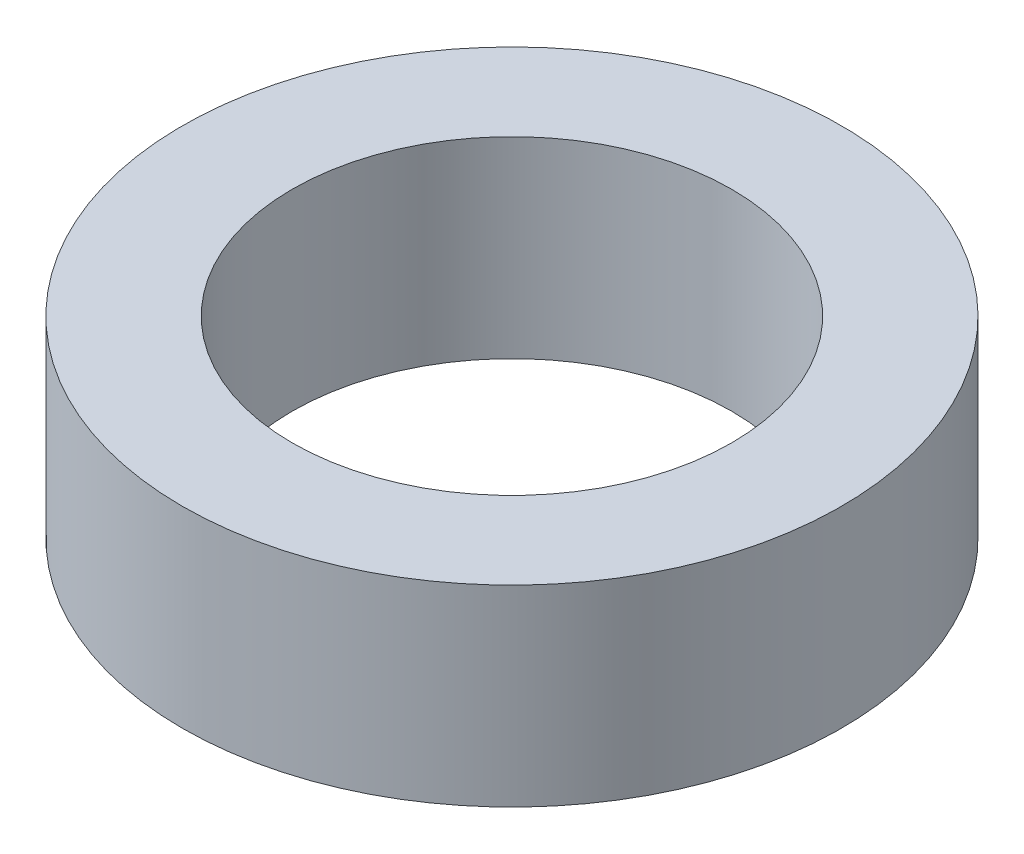
ISO-10303-21;
HEADER;
FILE_DESCRIPTION(('STEP AP214'),'2;1');
FILE_NAME('part.step','',(''),(''),'','','');
FILE_SCHEMA(('AUTOMOTIVE_DESIGN { 1 0 10303 214 1 1 1 1 }'));
ENDSEC;
DATA;
#1=APPLICATION_CONTEXT('core data for automotive mechanical design processes');
#2=APPLICATION_PROTOCOL_DEFINITION('international standard','automotive_design',2000,#1);
#3=PRODUCT_CONTEXT('',#1,'mechanical');
#4=PRODUCT('Part','Part','',(#3));
#5=PRODUCT_RELATED_PRODUCT_CATEGORY('part','',(#4));
#6=PRODUCT_DEFINITION_FORMATION('','',#4);
#7=PRODUCT_DEFINITION_CONTEXT('part definition',#1,'design');
#8=PRODUCT_DEFINITION('design','',#6,#7);
#9=PRODUCT_DEFINITION_SHAPE('','',#8);
#10=(LENGTH_UNIT() NAMED_UNIT(*) SI_UNIT(.MILLI.,.METRE.));
#11=(NAMED_UNIT(*) PLANE_ANGLE_UNIT() SI_UNIT($,.RADIAN.));
#12=(NAMED_UNIT(*) SI_UNIT($,.STERADIAN.) SOLID_ANGLE_UNIT());
#13=UNCERTAINTY_MEASURE_WITH_UNIT(LENGTH_MEASURE(1.E-05),#10,'distance_accuracy_value','');
#14=(GEOMETRIC_REPRESENTATION_CONTEXT(3) GLOBAL_UNCERTAINTY_ASSIGNED_CONTEXT((#13)) GLOBAL_UNIT_ASSIGNED_CONTEXT((#10,
#11,#12)) REPRESENTATION_CONTEXT('',''));
#15=CARTESIAN_POINT('',(0.,0.,0.));
#16=DIRECTION('',(0.,0.,1.));
#17=DIRECTION('',(1.,0.,0.));
#18=AXIS2_PLACEMENT_3D('',#15,#16,#17);
#19=CARTESIAN_POINT('',(0.,7.,0.));
#20=DIRECTION('',(0.,1.,0.));
#21=DIRECTION('',(0.,0.,1.));
#22=AXIS2_PLACEMENT_3D('',#19,#20,#21);
#23=PLANE('',#22);
#24=CARTESIAN_POINT('',(0.,7.,0.));
#25=DIRECTION('',(0.,1.,0.));
#26=DIRECTION('',(0.,0.,1.));
#27=AXIS2_PLACEMENT_3D('',#24,#25,#26);
#28=CIRCLE('',#27,12.);
#29=CARTESIAN_POINT('',(0.,7.,12.));
#30=VERTEX_POINT('',#29);
#31=EDGE_CURVE('E10',#30,#30,#28,.T.);
#32=ORIENTED_EDGE('',*,*,#31,.T.);
#33=EDGE_LOOP('',(#32));
#34=FACE_BOUND('',#33,.T.);
#35=CARTESIAN_POINT('',(0.,7.,0.));
#36=DIRECTION('',(0.,1.,0.));
#37=DIRECTION('',(0.,0.,1.));
#38=AXIS2_PLACEMENT_3D('',#35,#36,#37);
#39=CIRCLE('',#38,8.);
#40=CARTESIAN_POINT('',(0.,7.,8.));
#41=VERTEX_POINT('',#40);
#42=EDGE_CURVE('E45',#41,#41,#39,.T.);
#43=ORIENTED_EDGE('',*,*,#42,.F.);
#44=EDGE_LOOP('',(#43));
#45=FACE_BOUND('',#44,.T.);
#46=ADVANCED_FACE('F34',(#34,#45),#23,.T.);
#47=CARTESIAN_POINT('',(0.,0.,0.));
#48=DIRECTION('',(0.,1.,0.));
#49=DIRECTION('',(0.,0.,1.));
#50=AXIS2_PLACEMENT_3D('',#47,#48,#49);
#51=PLANE('',#50);
#52=CARTESIAN_POINT('',(0.,0.,0.));
#53=DIRECTION('',(0.,1.,0.));
#54=DIRECTION('',(0.,0.,1.));
#55=AXIS2_PLACEMENT_3D('',#52,#53,#54);
#56=CIRCLE('',#55,12.);
#57=CARTESIAN_POINT('',(0.,0.,12.));
#58=VERTEX_POINT('',#57);
#59=EDGE_CURVE('E38',#58,#58,#56,.T.);
#60=ORIENTED_EDGE('',*,*,#59,.F.);
#61=EDGE_LOOP('',(#60));
#62=FACE_BOUND('',#61,.T.);
#63=CARTESIAN_POINT('',(0.,0.,0.));
#64=DIRECTION('',(0.,1.,0.));
#65=DIRECTION('',(0.,0.,1.));
#66=AXIS2_PLACEMENT_3D('',#63,#64,#65);
#67=CIRCLE('',#66,8.);
#68=CARTESIAN_POINT('',(0.,0.,8.));
#69=VERTEX_POINT('',#68);
#70=EDGE_CURVE('E47',#69,#69,#67,.T.);
#71=ORIENTED_EDGE('',*,*,#70,.T.);
#72=EDGE_LOOP('',(#71));
#73=FACE_BOUND('',#72,.T.);
#74=ADVANCED_FACE('F57',(#62,#73),#51,.F.);
#75=CARTESIAN_POINT('',(0.,7.,0.));
#76=DIRECTION('',(0.,-1.,0.));
#77=DIRECTION('',(0.,0.,-1.));
#78=AXIS2_PLACEMENT_3D('',#75,#76,#77);
#79=CYLINDRICAL_SURFACE('',#78,12.);
#80=ORIENTED_EDGE('',*,*,#31,.F.);
#81=EDGE_LOOP('',(#80));
#82=FACE_BOUND('',#81,.T.);
#83=ORIENTED_EDGE('',*,*,#59,.T.);
#84=EDGE_LOOP('',(#83));
#85=FACE_BOUND('',#84,.T.);
#86=ADVANCED_FACE('F36',(#82,#85),#79,.T.);
#87=CARTESIAN_POINT('',(0.,7.,0.));
#88=DIRECTION('',(0.,-1.,0.));
#89=DIRECTION('',(0.,0.,-1.));
#90=AXIS2_PLACEMENT_3D('',#87,#88,#89);
#91=CYLINDRICAL_SURFACE('',#90,8.);
#92=ORIENTED_EDGE('',*,*,#42,.T.);
#93=EDGE_LOOP('',(#92));
#94=FACE_BOUND('',#93,.T.);
#95=ORIENTED_EDGE('',*,*,#70,.F.);
#96=EDGE_LOOP('',(#95));
#97=FACE_BOUND('',#96,.T.);
#98=ADVANCED_FACE('F53',(#94,#97),#91,.F.);
#99=CLOSED_SHELL('',(#46,#74,#86,#98));
#100=MANIFOLD_SOLID_BREP('B2',#99);
#101=ADVANCED_BREP_SHAPE_REPRESENTATION('',(#18,#100),#14);
#102=SHAPE_DEFINITION_REPRESENTATION(#9,#101);
ENDSEC;
END-ISO-10303-21;
